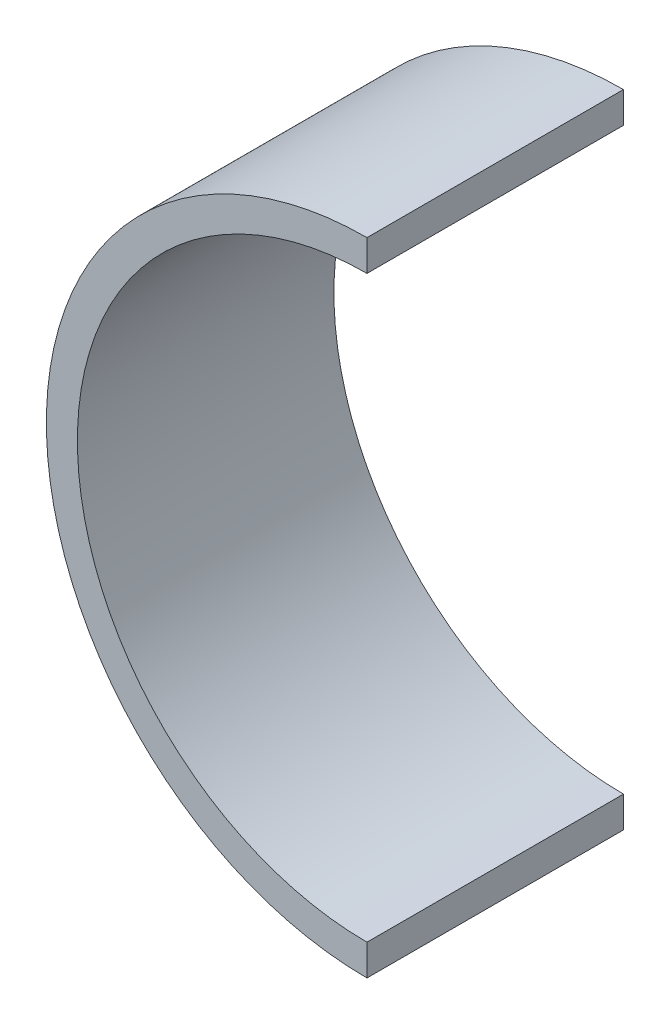
ISO-10303-21;
HEADER;
FILE_DESCRIPTION(('STEP AP214'),'2;1');
FILE_NAME('part.step','',(''),(''),'','','');
FILE_SCHEMA(('AUTOMOTIVE_DESIGN { 1 0 10303 214 1 1 1 1 }'));
ENDSEC;
DATA;
#1=APPLICATION_CONTEXT('core data for automotive mechanical design processes');
#2=APPLICATION_PROTOCOL_DEFINITION('international standard','automotive_design',2000,#1);
#3=PRODUCT_CONTEXT('',#1,'mechanical');
#4=PRODUCT('Part','Part','',(#3));
#5=PRODUCT_RELATED_PRODUCT_CATEGORY('part','',(#4));
#6=PRODUCT_DEFINITION_FORMATION('','',#4);
#7=PRODUCT_DEFINITION_CONTEXT('part definition',#1,'design');
#8=PRODUCT_DEFINITION('design','',#6,#7);
#9=PRODUCT_DEFINITION_SHAPE('','',#8);
#10=(LENGTH_UNIT() NAMED_UNIT(*) SI_UNIT(.MILLI.,.METRE.));
#11=(NAMED_UNIT(*) PLANE_ANGLE_UNIT() SI_UNIT($,.RADIAN.));
#12=(NAMED_UNIT(*) SI_UNIT($,.STERADIAN.) SOLID_ANGLE_UNIT());
#13=UNCERTAINTY_MEASURE_WITH_UNIT(LENGTH_MEASURE(1.E-05),#10,'distance_accuracy_value','');
#14=(GEOMETRIC_REPRESENTATION_CONTEXT(3) GLOBAL_UNCERTAINTY_ASSIGNED_CONTEXT((#13)) GLOBAL_UNIT_ASSIGNED_CONTEXT((#10,
#11,#12)) REPRESENTATION_CONTEXT('',''));
#15=CARTESIAN_POINT('',(0.,0.,0.));
#16=DIRECTION('',(0.,0.,1.));
#17=DIRECTION('',(1.,0.,0.));
#18=AXIS2_PLACEMENT_3D('',#15,#16,#17);
#19=CARTESIAN_POINT('',(0.,0.,123.999999999999));
#20=DIRECTION('',(0.,0.,-1.));
#21=DIRECTION('',(-1.,0.,0.));
#22=AXIS2_PLACEMENT_3D('',#19,#20,#21);
#23=CYLINDRICAL_SURFACE('',#22,310.);
#24=DIRECTION('',(0.,0.,-1.));
#25=VECTOR('',#24,1.);
#26=CARTESIAN_POINT('',(0.,310.,123.999999999999));
#27=LINE('',#26,#25);
#28=CARTESIAN_POINT('',(0.,310.,123.999999999999));
#29=VERTEX_POINT('',#28);
#30=CARTESIAN_POINT('',(0.,310.,-124.));
#31=VERTEX_POINT('',#30);
#32=EDGE_CURVE('E98',#29,#31,#27,.T.);
#33=ORIENTED_EDGE('',*,*,#32,.T.);
#34=CARTESIAN_POINT('',(0.,0.,-124.));
#35=DIRECTION('',(0.,0.,1.));
#36=DIRECTION('',(1.,0.,0.));
#37=AXIS2_PLACEMENT_3D('',#34,#35,#36);
#38=CIRCLE('',#37,310.);
#39=CARTESIAN_POINT('',(0.,-310.,-124.));
#40=VERTEX_POINT('',#39);
#41=EDGE_CURVE('E93',#31,#40,#38,.T.);
#42=ORIENTED_EDGE('',*,*,#41,.T.);
#43=DIRECTION('',(0.,0.,-1.));
#44=VECTOR('',#43,1.);
#45=CARTESIAN_POINT('',(0.,-310.,123.999999999999));
#46=LINE('',#45,#44);
#47=CARTESIAN_POINT('',(0.,-310.,123.999999999999));
#48=VERTEX_POINT('',#47);
#49=EDGE_CURVE('E11',#48,#40,#46,.T.);
#50=ORIENTED_EDGE('',*,*,#49,.F.);
#51=CARTESIAN_POINT('',(0.,0.,123.999999999999));
#52=DIRECTION('',(0.,0.,1.));
#53=DIRECTION('',(1.,0.,0.));
#54=AXIS2_PLACEMENT_3D('',#51,#52,#53);
#55=CIRCLE('',#54,310.);
#56=EDGE_CURVE('E104',#29,#48,#55,.T.);
#57=ORIENTED_EDGE('',*,*,#56,.F.);
#58=EDGE_LOOP('',(#33,#42,#50,#57));
#59=FACE_BOUND('',#58,.T.);
#60=ADVANCED_FACE('F41',(#59),#23,.T.);
#61=CARTESIAN_POINT('',(0.,-280.,123.999999999999));
#62=DIRECTION('',(-1.,0.,0.));
#63=DIRECTION('',(0.,0.,1.));
#64=AXIS2_PLACEMENT_3D('',#61,#62,#63);
#65=PLANE('',#64);
#66=ORIENTED_EDGE('',*,*,#49,.T.);
#67=DIRECTION('',(0.,1.,0.));
#68=VECTOR('',#67,1.);
#69=CARTESIAN_POINT('',(0.,-280.,-124.));
#70=LINE('',#69,#68);
#71=CARTESIAN_POINT('',(0.,-280.,-124.));
#72=VERTEX_POINT('',#71);
#73=EDGE_CURVE('E83',#40,#72,#70,.T.);
#74=ORIENTED_EDGE('',*,*,#73,.T.);
#75=DIRECTION('',(0.,0.,-1.));
#76=VECTOR('',#75,1.);
#77=CARTESIAN_POINT('',(0.,-280.,123.999999999999));
#78=LINE('',#77,#76);
#79=CARTESIAN_POINT('',(0.,-280.,123.999999999999));
#80=VERTEX_POINT('',#79);
#81=EDGE_CURVE('E48',#80,#72,#78,.T.);
#82=ORIENTED_EDGE('',*,*,#81,.F.);
#83=DIRECTION('',(0.,1.,0.));
#84=VECTOR('',#83,1.);
#85=CARTESIAN_POINT('',(0.,-280.,123.999999999999));
#86=LINE('',#85,#84);
#87=EDGE_CURVE('E84',#48,#80,#86,.T.);
#88=ORIENTED_EDGE('',*,*,#87,.F.);
#89=EDGE_LOOP('',(#66,#74,#82,#88));
#90=FACE_BOUND('',#89,.T.);
#91=ADVANCED_FACE('F81',(#90),#65,.F.);
#92=CARTESIAN_POINT('',(0.,0.,123.999999999999));
#93=DIRECTION('',(0.,0.,-1.));
#94=DIRECTION('',(-1.,0.,0.));
#95=AXIS2_PLACEMENT_3D('',#92,#93,#94);
#96=CYLINDRICAL_SURFACE('',#95,280.);
#97=ORIENTED_EDGE('',*,*,#81,.T.);
#98=CARTESIAN_POINT('',(0.,0.,-124.));
#99=DIRECTION('',(0.,0.,-1.));
#100=DIRECTION('',(1.,0.,0.));
#101=AXIS2_PLACEMENT_3D('',#98,#99,#100);
#102=CIRCLE('',#101,280.);
#103=CARTESIAN_POINT('',(0.,280.,-124.));
#104=VERTEX_POINT('',#103);
#105=EDGE_CURVE('E96',#72,#104,#102,.T.);
#106=ORIENTED_EDGE('',*,*,#105,.T.);
#107=DIRECTION('',(0.,0.,-1.));
#108=VECTOR('',#107,1.);
#109=CARTESIAN_POINT('',(0.,280.,123.999999999999));
#110=LINE('',#109,#108);
#111=CARTESIAN_POINT('',(0.,280.,123.999999999999));
#112=VERTEX_POINT('',#111);
#113=EDGE_CURVE('E110',#112,#104,#110,.T.);
#114=ORIENTED_EDGE('',*,*,#113,.F.);
#115=CARTESIAN_POINT('',(0.,0.,123.999999999999));
#116=DIRECTION('',(0.,0.,-1.));
#117=DIRECTION('',(1.,0.,0.));
#118=AXIS2_PLACEMENT_3D('',#115,#116,#117);
#119=CIRCLE('',#118,280.);
#120=EDGE_CURVE('E60',#80,#112,#119,.T.);
#121=ORIENTED_EDGE('',*,*,#120,.F.);
#122=EDGE_LOOP('',(#97,#106,#114,#121));
#123=FACE_BOUND('',#122,.T.);
#124=ADVANCED_FACE('F112',(#123),#96,.F.);
#125=CARTESIAN_POINT('',(0.,310.,123.999999999999));
#126=DIRECTION('',(-1.,0.,0.));
#127=DIRECTION('',(0.,0.,1.));
#128=AXIS2_PLACEMENT_3D('',#125,#126,#127);
#129=PLANE('',#128);
#130=ORIENTED_EDGE('',*,*,#113,.T.);
#131=DIRECTION('',(0.,1.,0.));
#132=VECTOR('',#131,1.);
#133=CARTESIAN_POINT('',(0.,310.,-124.));
#134=LINE('',#133,#132);
#135=EDGE_CURVE('E102',#104,#31,#134,.T.);
#136=ORIENTED_EDGE('',*,*,#135,.T.);
#137=ORIENTED_EDGE('',*,*,#32,.F.);
#138=DIRECTION('',(0.,1.,0.));
#139=VECTOR('',#138,1.);
#140=CARTESIAN_POINT('',(0.,310.,123.999999999999));
#141=LINE('',#140,#139);
#142=EDGE_CURVE('E55',#112,#29,#141,.T.);
#143=ORIENTED_EDGE('',*,*,#142,.F.);
#144=EDGE_LOOP('',(#130,#136,#137,#143));
#145=FACE_BOUND('',#144,.T.);
#146=ADVANCED_FACE('F114',(#145),#129,.F.);
#147=CARTESIAN_POINT('',(0.,0.,123.999999999999));
#148=DIRECTION('',(0.,0.,1.));
#149=DIRECTION('',(1.,0.,0.));
#150=AXIS2_PLACEMENT_3D('',#147,#148,#149);
#151=PLANE('',#150);
#152=ORIENTED_EDGE('',*,*,#56,.T.);
#153=ORIENTED_EDGE('',*,*,#87,.T.);
#154=ORIENTED_EDGE('',*,*,#120,.T.);
#155=ORIENTED_EDGE('',*,*,#142,.T.);
#156=EDGE_LOOP('',(#152,#153,#154,#155));
#157=FACE_BOUND('',#156,.T.);
#158=ADVANCED_FACE('F115',(#157),#151,.T.);
#159=CARTESIAN_POINT('',(0.,0.,-124.));
#160=DIRECTION('',(0.,0.,1.));
#161=DIRECTION('',(1.,0.,0.));
#162=AXIS2_PLACEMENT_3D('',#159,#160,#161);
#163=PLANE('',#162);
#164=ORIENTED_EDGE('',*,*,#41,.F.);
#165=ORIENTED_EDGE('',*,*,#135,.F.);
#166=ORIENTED_EDGE('',*,*,#105,.F.);
#167=ORIENTED_EDGE('',*,*,#73,.F.);
#168=EDGE_LOOP('',(#164,#165,#166,#167));
#169=FACE_BOUND('',#168,.T.);
#170=ADVANCED_FACE('F91',(#169),#163,.F.);
#171=CLOSED_SHELL('',(#60,#91,#124,#146,#158,#170));
#172=MANIFOLD_SOLID_BREP('B2',#171);
#173=ADVANCED_BREP_SHAPE_REPRESENTATION('',(#18,#172),#14);
#174=SHAPE_DEFINITION_REPRESENTATION(#9,#173);
ENDSEC;
END-ISO-10303-21;
